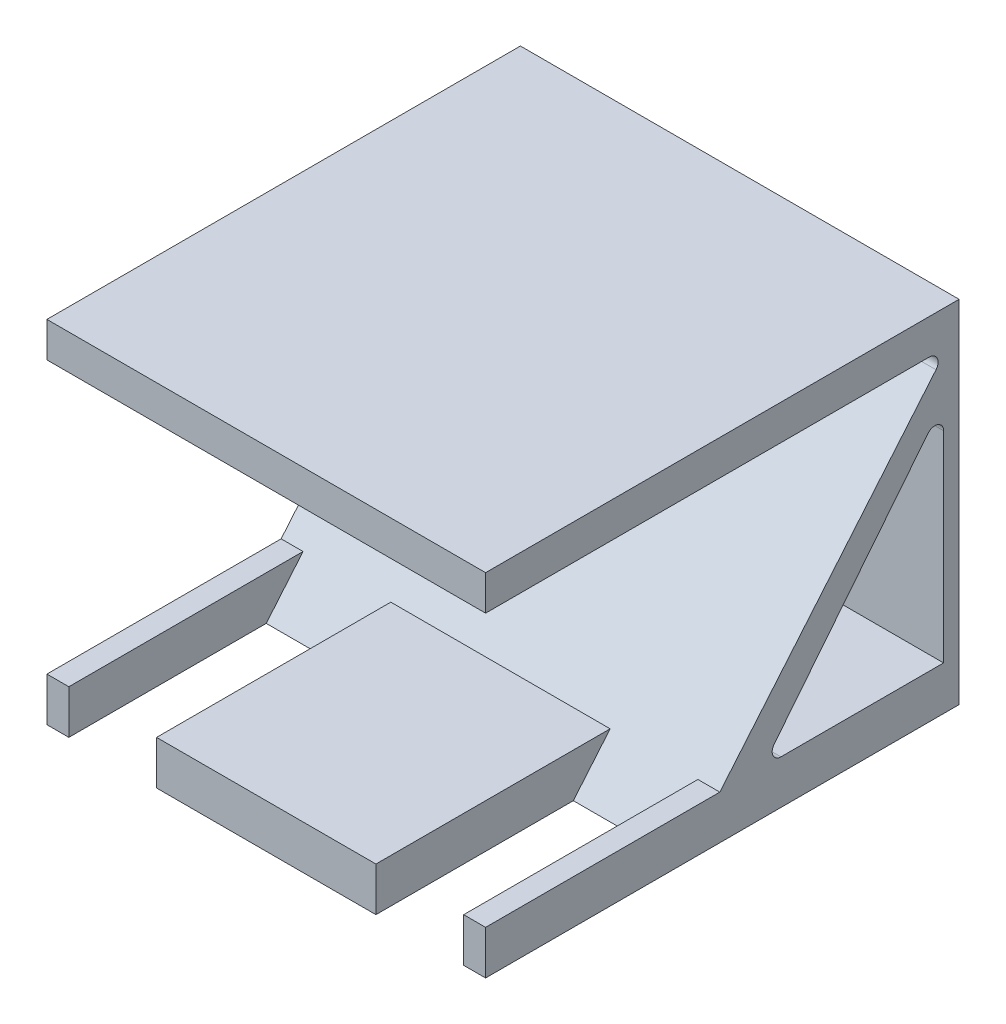
ISO-10303-21;
HEADER;
FILE_DESCRIPTION(('STEP AP214'),'2;1');
FILE_NAME('part.step','',(''),(''),'','','');
FILE_SCHEMA(('AUTOMOTIVE_DESIGN { 1 0 10303 214 1 1 1 1 }'));
ENDSEC;
DATA;
#1=APPLICATION_CONTEXT('core data for automotive mechanical design processes');
#2=APPLICATION_PROTOCOL_DEFINITION('international standard','automotive_design',2000,#1);
#3=PRODUCT_CONTEXT('',#1,'mechanical');
#4=PRODUCT('Part','Part','',(#3));
#5=PRODUCT_RELATED_PRODUCT_CATEGORY('part','',(#4));
#6=PRODUCT_DEFINITION_FORMATION('','',#4);
#7=PRODUCT_DEFINITION_CONTEXT('part definition',#1,'design');
#8=PRODUCT_DEFINITION('design','',#6,#7);
#9=PRODUCT_DEFINITION_SHAPE('','',#8);
#10=(LENGTH_UNIT() NAMED_UNIT(*) SI_UNIT(.MILLI.,.METRE.));
#11=(NAMED_UNIT(*) PLANE_ANGLE_UNIT() SI_UNIT($,.RADIAN.));
#12=(NAMED_UNIT(*) SI_UNIT($,.STERADIAN.) SOLID_ANGLE_UNIT());
#13=UNCERTAINTY_MEASURE_WITH_UNIT(LENGTH_MEASURE(1.E-05),#10,'distance_accuracy_value','');
#14=(GEOMETRIC_REPRESENTATION_CONTEXT(3) GLOBAL_UNCERTAINTY_ASSIGNED_CONTEXT((#13)) GLOBAL_UNIT_ASSIGNED_CONTEXT((#10,
#11,#12)) REPRESENTATION_CONTEXT('',''));
#15=CARTESIAN_POINT('',(0.,0.,0.));
#16=DIRECTION('',(0.,0.,1.));
#17=DIRECTION('',(1.,0.,0.));
#18=AXIS2_PLACEMENT_3D('',#15,#16,#17);
#19=CARTESIAN_POINT('',(-50.,10.,0.));
#20=DIRECTION('',(-1.,0.,0.));
#21=DIRECTION('',(0.,0.,1.));
#22=AXIS2_PLACEMENT_3D('',#19,#20,#21);
#23=PLANE('',#22);
#24=DIRECTION('',(0.,0.,1.));
#25=VECTOR('',#24,1.);
#26=CARTESIAN_POINT('',(-50.,80.018086391554,-62.9324723382966));
#27=LINE('',#26,#25);
#28=CARTESIAN_POINT('',(-50.,80.018086391554,-62.9324723382966));
#29=VERTEX_POINT('',#28);
#30=CARTESIAN_POINT('',(-50.,80.018086391554,45.));
#31=VERTEX_POINT('',#30);
#32=EDGE_CURVE('E208',#29,#31,#27,.T.);
#33=ORIENTED_EDGE('',*,*,#32,.F.);
#34=DIRECTION('',(0.,1.,0.));
#35=VECTOR('',#34,1.);
#36=CARTESIAN_POINT('',(-50.,0.,-62.9324723382966));
#37=LINE('',#36,#35);
#38=CARTESIAN_POINT('',(-50.,0.,-62.9324723382966));
#39=VERTEX_POINT('',#38);
#40=EDGE_CURVE('E292',#39,#29,#37,.T.);
#41=ORIENTED_EDGE('',*,*,#40,.F.);
#42=DIRECTION('',(0.,0.,-1.));
#43=VECTOR('',#42,1.);
#44=CARTESIAN_POINT('',(-50.,0.,0.));
#45=LINE('',#44,#43);
#46=CARTESIAN_POINT('',(-50.,0.,45.));
#47=VERTEX_POINT('',#46);
#48=EDGE_CURVE('E327',#47,#39,#45,.T.);
#49=ORIENTED_EDGE('',*,*,#48,.F.);
#50=DIRECTION('',(0.,-1.,0.));
#51=VECTOR('',#50,1.);
#52=CARTESIAN_POINT('',(-50.,10.,45.));
#53=LINE('',#52,#51);
#54=CARTESIAN_POINT('',(-50.,10.,45.));
#55=VERTEX_POINT('',#54);
#56=EDGE_CURVE('E333',#55,#47,#53,.T.);
#57=ORIENTED_EDGE('',*,*,#56,.F.);
#58=DIRECTION('',(0.,0.,-1.));
#59=VECTOR('',#58,1.);
#60=CARTESIAN_POINT('',(-50.,10.,0.));
#61=LINE('',#60,#59);
#62=CARTESIAN_POINT('',(-50.,10.,-8.39099631177287));
#63=VERTEX_POINT('',#62);
#64=EDGE_CURVE('E318',#55,#63,#61,.T.);
#65=ORIENTED_EDGE('',*,*,#64,.T.);
#66=DIRECTION('',(0.,-0.766044443118975,0.642787609686543));
#67=VECTOR('',#66,1.);
#68=CARTESIAN_POINT('',(-50.,0.,0.));
#69=LINE('',#68,#67);
#70=CARTESIAN_POINT('',(-50.,68.7325111721809,-57.6734247744658));
#71=VERTEX_POINT('',#70);
#72=EDGE_CURVE('E296',#71,#63,#69,.T.);
#73=ORIENTED_EDGE('',*,*,#72,.F.);
#74=CARTESIAN_POINT('',(-50.,70.018086391554,-56.1413358882279));
#75=DIRECTION('',(-1.,0.,0.));
#76=DIRECTION('',(0.,0.,1.));
#77=AXIS2_PLACEMENT_3D('',#74,#75,#76);
#78=CIRCLE('',#77,2.);
#79=CARTESIAN_POINT('',(-50.,72.018086391554,-56.1413358882279));
#80=VERTEX_POINT('',#79);
#81=EDGE_CURVE('E11',#71,#80,#78,.F.);
#82=ORIENTED_EDGE('',*,*,#81,.T.);
#83=DIRECTION('',(0.,0.,-1.));
#84=VECTOR('',#83,1.);
#85=CARTESIAN_POINT('',(-50.,72.018086391554,-62.9324723382966));
#86=LINE('',#85,#84);
#87=CARTESIAN_POINT('',(-50.,72.018086391554,45.));
#88=VERTEX_POINT('',#87);
#89=EDGE_CURVE('E227',#88,#80,#86,.T.);
#90=ORIENTED_EDGE('',*,*,#89,.F.);
#91=DIRECTION('',(0.,-1.,0.));
#92=VECTOR('',#91,1.);
#93=CARTESIAN_POINT('',(-50.,72.018086391554,45.));
#94=LINE('',#93,#92);
#95=EDGE_CURVE('E233',#31,#88,#94,.T.);
#96=ORIENTED_EDGE('',*,*,#95,.F.);
#97=EDGE_LOOP('',(#33,#41,#49,#57,#65,#73,#82,#90,#96));
#98=FACE_BOUND('',#97,.T.);
#99=DIRECTION('',(0.,0.,1.));
#100=VECTOR('',#99,1.);
#101=CARTESIAN_POINT('',(-50.,10.,-59.3985052477175));
#102=LINE('',#101,#100);
#103=CARTESIAN_POINT('',(-50.,10.,-59.3985052477175));
#104=VERTEX_POINT('',#103);
#105=CARTESIAN_POINT('',(-50.,10.,-22.3186865983815));
#106=VERTEX_POINT('',#105);
#107=EDGE_CURVE('E220',#104,#106,#102,.T.);
#108=ORIENTED_EDGE('',*,*,#107,.F.);
#109=DIRECTION('',(0.,-1.,0.));
#110=VECTOR('',#109,1.);
#111=CARTESIAN_POINT('',(-50.,61.5268113359665,-59.3985052477175));
#112=LINE('',#111,#110);
#113=CARTESIAN_POINT('',(-50.,55.827509606127,-59.3985052477175));
#114=VERTEX_POINT('',#113);
#115=EDGE_CURVE('E204',#114,#104,#112,.T.);
#116=ORIENTED_EDGE('',*,*,#115,.F.);
#117=CARTESIAN_POINT('',(-50.,55.827509606127,-57.3985052477175));
#118=DIRECTION('',(-1.,0.,0.));
#119=DIRECTION('',(0.,0.,1.));
#120=AXIS2_PLACEMENT_3D('',#117,#118,#119);
#121=CIRCLE('',#120,2.);
#122=CARTESIAN_POINT('',(-50.,57.0772865807444,-55.8370772110421));
#123=VERTEX_POINT('',#122);
#124=EDGE_CURVE('E354',#114,#123,#121,.F.);
#125=ORIENTED_EDGE('',*,*,#124,.T.);
#126=DIRECTION('',(0.,0.78071401833771,-0.624888487308724));
#127=VECTOR('',#126,1.);
#128=CARTESIAN_POINT('',(-50.,10.,-18.1561163123542));
#129=LINE('',#128,#127);
#130=CARTESIAN_POINT('',(-50.,13.2497769746174,-20.757258561706));
#131=VERTEX_POINT('',#130);
#132=EDGE_CURVE('E209',#131,#123,#129,.T.);
#133=ORIENTED_EDGE('',*,*,#132,.F.);
#134=CARTESIAN_POINT('',(-50.,12.,-22.3186865983814));
#135=DIRECTION('',(-1.,0.,0.));
#136=DIRECTION('',(0.,0.,1.));
#137=AXIS2_PLACEMENT_3D('',#134,#135,#136);
#138=CIRCLE('',#137,2.);
#139=EDGE_CURVE('E351',#131,#106,#138,.F.);
#140=ORIENTED_EDGE('',*,*,#139,.T.);
#141=EDGE_LOOP('',(#108,#116,#125,#133,#140));
#142=FACE_BOUND('',#141,.T.);
#143=ADVANCED_FACE('F43',(#98,#142),#23,.T.);
#144=CARTESIAN_POINT('',(50.,0.,0.));
#145=DIRECTION('',(1.,0.,0.));
#146=DIRECTION('',(0.,0.,-1.));
#147=AXIS2_PLACEMENT_3D('',#144,#145,#146);
#148=PLANE('',#147);
#149=DIRECTION('',(0.,1.,0.));
#150=VECTOR('',#149,1.);
#151=CARTESIAN_POINT('',(50.,0.,-62.9324723382966));
#152=LINE('',#151,#150);
#153=CARTESIAN_POINT('',(50.,0.,-62.9324723382966));
#154=VERTEX_POINT('',#153);
#155=CARTESIAN_POINT('',(50.,80.018086391554,-62.9324723382966));
#156=VERTEX_POINT('',#155);
#157=EDGE_CURVE('E295',#154,#156,#152,.T.);
#158=ORIENTED_EDGE('',*,*,#157,.T.);
#159=DIRECTION('',(0.,0.,1.));
#160=VECTOR('',#159,1.);
#161=CARTESIAN_POINT('',(50.,80.018086391554,-62.9324723382966));
#162=LINE('',#161,#160);
#163=CARTESIAN_POINT('',(50.,80.018086391554,45.));
#164=VERTEX_POINT('',#163);
#165=EDGE_CURVE('E224',#156,#164,#162,.T.);
#166=ORIENTED_EDGE('',*,*,#165,.T.);
#167=DIRECTION('',(0.,-1.,0.));
#168=VECTOR('',#167,1.);
#169=CARTESIAN_POINT('',(50.,72.018086391554,45.));
#170=LINE('',#169,#168);
#171=CARTESIAN_POINT('',(50.,72.018086391554,45.));
#172=VERTEX_POINT('',#171);
#173=EDGE_CURVE('E226',#164,#172,#170,.T.);
#174=ORIENTED_EDGE('',*,*,#173,.T.);
#175=DIRECTION('',(0.,0.,-1.));
#176=VECTOR('',#175,1.);
#177=CARTESIAN_POINT('',(50.,72.018086391554,-62.9324723382966));
#178=LINE('',#177,#176);
#179=CARTESIAN_POINT('',(50.,72.018086391554,-56.1413358882279));
#180=VERTEX_POINT('',#179);
#181=EDGE_CURVE('E229',#172,#180,#178,.T.);
#182=ORIENTED_EDGE('',*,*,#181,.T.);
#183=CARTESIAN_POINT('',(50.,70.018086391554,-56.1413358882279));
#184=DIRECTION('',(1.,0.,0.));
#185=DIRECTION('',(0.,0.,-1.));
#186=AXIS2_PLACEMENT_3D('',#183,#184,#185);
#187=CIRCLE('',#186,2.);
#188=CARTESIAN_POINT('',(50.,68.7325111721809,-57.6734247744658));
#189=VERTEX_POINT('',#188);
#190=EDGE_CURVE('E51',#180,#189,#187,.F.);
#191=ORIENTED_EDGE('',*,*,#190,.T.);
#192=DIRECTION('',(0.,-0.766044443118975,0.642787609686543));
#193=VECTOR('',#192,1.);
#194=CARTESIAN_POINT('',(50.,0.,0.));
#195=LINE('',#194,#193);
#196=CARTESIAN_POINT('',(50.,10.,-8.39099631177287));
#197=VERTEX_POINT('',#196);
#198=EDGE_CURVE('E298',#189,#197,#195,.T.);
#199=ORIENTED_EDGE('',*,*,#198,.T.);
#200=DIRECTION('',(0.,0.,-1.));
#201=VECTOR('',#200,1.);
#202=CARTESIAN_POINT('',(50.,10.,0.));
#203=LINE('',#202,#201);
#204=CARTESIAN_POINT('',(50.,10.,45.));
#205=VERTEX_POINT('',#204);
#206=EDGE_CURVE('E277',#205,#197,#203,.T.);
#207=ORIENTED_EDGE('',*,*,#206,.F.);
#208=DIRECTION('',(0.,-1.,0.));
#209=VECTOR('',#208,1.);
#210=CARTESIAN_POINT('',(50.,10.,45.));
#211=LINE('',#210,#209);
#212=CARTESIAN_POINT('',(50.,0.,45.));
#213=VERTEX_POINT('',#212);
#214=EDGE_CURVE('E280',#205,#213,#211,.T.);
#215=ORIENTED_EDGE('',*,*,#214,.T.);
#216=DIRECTION('',(0.,0.,-1.));
#217=VECTOR('',#216,1.);
#218=CARTESIAN_POINT('',(50.,0.,0.));
#219=LINE('',#218,#217);
#220=EDGE_CURVE('E293',#213,#154,#219,.T.);
#221=ORIENTED_EDGE('',*,*,#220,.T.);
#222=EDGE_LOOP('',(#158,#166,#174,#182,#191,#199,#207,#215,#221));
#223=FACE_BOUND('',#222,.T.);
#224=DIRECTION('',(0.,0.,1.));
#225=VECTOR('',#224,1.);
#226=CARTESIAN_POINT('',(50.,10.,-59.3985052477175));
#227=LINE('',#226,#225);
#228=CARTESIAN_POINT('',(50.,10.,-59.3985052477175));
#229=VERTEX_POINT('',#228);
#230=CARTESIAN_POINT('',(50.,10.,-22.3186865983815));
#231=VERTEX_POINT('',#230);
#232=EDGE_CURVE('E194',#229,#231,#227,.T.);
#233=ORIENTED_EDGE('',*,*,#232,.T.);
#234=CARTESIAN_POINT('',(50.,12.,-22.3186865983814));
#235=DIRECTION('',(1.,0.,0.));
#236=DIRECTION('',(0.,0.,-1.));
#237=AXIS2_PLACEMENT_3D('',#234,#235,#236);
#238=CIRCLE('',#237,2.);
#239=CARTESIAN_POINT('',(50.,13.2497769746174,-20.757258561706));
#240=VERTEX_POINT('',#239);
#241=EDGE_CURVE('E349',#231,#240,#238,.F.);
#242=ORIENTED_EDGE('',*,*,#241,.T.);
#243=DIRECTION('',(0.,0.78071401833771,-0.624888487308724));
#244=VECTOR('',#243,1.);
#245=CARTESIAN_POINT('',(50.,10.,-18.1561163123542));
#246=LINE('',#245,#244);
#247=CARTESIAN_POINT('',(50.,57.0772865807444,-55.8370772110421));
#248=VERTEX_POINT('',#247);
#249=EDGE_CURVE('E215',#240,#248,#246,.T.);
#250=ORIENTED_EDGE('',*,*,#249,.T.);
#251=CARTESIAN_POINT('',(50.,55.827509606127,-57.3985052477175));
#252=DIRECTION('',(1.,0.,0.));
#253=DIRECTION('',(0.,0.,-1.));
#254=AXIS2_PLACEMENT_3D('',#251,#252,#253);
#255=CIRCLE('',#254,2.);
#256=CARTESIAN_POINT('',(50.,55.827509606127,-59.3985052477175));
#257=VERTEX_POINT('',#256);
#258=EDGE_CURVE('E196',#248,#257,#255,.F.);
#259=ORIENTED_EDGE('',*,*,#258,.T.);
#260=DIRECTION('',(0.,-1.,0.));
#261=VECTOR('',#260,1.);
#262=CARTESIAN_POINT('',(50.,61.5268113359665,-59.3985052477175));
#263=LINE('',#262,#261);
#264=EDGE_CURVE('E190',#257,#229,#263,.T.);
#265=ORIENTED_EDGE('',*,*,#264,.T.);
#266=EDGE_LOOP('',(#233,#242,#250,#259,#265));
#267=FACE_BOUND('',#266,.T.);
#268=ADVANCED_FACE('F192',(#223,#267),#148,.T.);
#269=CARTESIAN_POINT('',(50.,0.,0.));
#270=DIRECTION('',(0.,-0.642787609686543,-0.766044443118975));
#271=DIRECTION('',(0.,0.766044443118975,-0.642787609686543));
#272=AXIS2_PLACEMENT_3D('',#269,#270,#271);
#273=PLANE('',#272);
#274=ORIENTED_EDGE('',*,*,#198,.F.);
#275=DIRECTION('',(1.,0.,0.));
#276=VECTOR('',#275,1.);
#277=CARTESIAN_POINT('',(-50.,68.7325111721809,-57.6734247744659));
#278=LINE('',#277,#276);
#279=EDGE_CURVE('E64',#189,#71,#278,.F.);
#280=ORIENTED_EDGE('',*,*,#279,.T.);
#281=ORIENTED_EDGE('',*,*,#72,.T.);
#282=DIRECTION('',(-1.,0.,0.));
#283=VECTOR('',#282,1.);
#284=CARTESIAN_POINT('',(0.,10.,-8.39099631177287));
#285=LINE('',#284,#283);
#286=CARTESIAN_POINT('',(-45.,10.,-8.39099631177287));
#287=VERTEX_POINT('',#286);
#288=EDGE_CURVE('E309',#287,#63,#285,.T.);
#289=ORIENTED_EDGE('',*,*,#288,.F.);
#290=DIRECTION('',(0.,0.766044443118975,-0.642787609686543));
#291=VECTOR('',#290,1.);
#292=CARTESIAN_POINT('',(-45.,5.86824088833461,-4.92403876506104));
#293=LINE('',#292,#291);
#294=CARTESIAN_POINT('',(-45.,0.,0.));
#295=VERTEX_POINT('',#294);
#296=EDGE_CURVE('E312',#295,#287,#293,.T.);
#297=ORIENTED_EDGE('',*,*,#296,.F.);
#298=DIRECTION('',(-1.,0.,0.));
#299=VECTOR('',#298,1.);
#300=CARTESIAN_POINT('',(50.,0.,0.));
#301=LINE('',#300,#299);
#302=CARTESIAN_POINT('',(-25.,0.,0.));
#303=VERTEX_POINT('',#302);
#304=EDGE_CURVE('E300',#303,#295,#301,.T.);
#305=ORIENTED_EDGE('',*,*,#304,.F.);
#306=DIRECTION('',(0.,-0.766044443118975,0.642787609686543));
#307=VECTOR('',#306,1.);
#308=CARTESIAN_POINT('',(-25.,0.,0.));
#309=LINE('',#308,#307);
#310=CARTESIAN_POINT('',(-25.,10.,-8.39099631177287));
#311=VERTEX_POINT('',#310);
#312=EDGE_CURVE('E265',#311,#303,#309,.T.);
#313=ORIENTED_EDGE('',*,*,#312,.F.);
#314=DIRECTION('',(1.,0.,0.));
#315=VECTOR('',#314,1.);
#316=CARTESIAN_POINT('',(50.,10.,-8.39099631177287));
#317=LINE('',#316,#315);
#318=CARTESIAN_POINT('',(25.,10.,-8.39099631177287));
#319=VERTEX_POINT('',#318);
#320=EDGE_CURVE('E338',#311,#319,#317,.T.);
#321=ORIENTED_EDGE('',*,*,#320,.T.);
#322=DIRECTION('',(0.,-0.766044443118975,0.642787609686543));
#323=VECTOR('',#322,1.);
#324=CARTESIAN_POINT('',(25.,0.,0.));
#325=LINE('',#324,#323);
#326=CARTESIAN_POINT('',(25.,0.,0.));
#327=VERTEX_POINT('',#326);
#328=EDGE_CURVE('E268',#319,#327,#325,.T.);
#329=ORIENTED_EDGE('',*,*,#328,.T.);
#330=CARTESIAN_POINT('',(45.,0.,0.));
#331=VERTEX_POINT('',#330);
#332=EDGE_CURVE('E303',#331,#327,#301,.T.);
#333=ORIENTED_EDGE('',*,*,#332,.F.);
#334=DIRECTION('',(0.,-0.766044443118975,0.642787609686543));
#335=VECTOR('',#334,1.);
#336=CARTESIAN_POINT('',(45.,0.,0.));
#337=LINE('',#336,#335);
#338=CARTESIAN_POINT('',(45.,10.,-8.39099631177287));
#339=VERTEX_POINT('',#338);
#340=EDGE_CURVE('E335',#339,#331,#337,.T.);
#341=ORIENTED_EDGE('',*,*,#340,.F.);
#342=DIRECTION('',(1.,0.,0.));
#343=VECTOR('',#342,1.);
#344=CARTESIAN_POINT('',(50.,10.,-8.39099631177287));
#345=LINE('',#344,#343);
#346=EDGE_CURVE('E289',#339,#197,#345,.T.);
#347=ORIENTED_EDGE('',*,*,#346,.T.);
#348=EDGE_LOOP('',(#274,#280,#281,#289,#297,#305,#313,#321,#329,#333,#341,#347));
#349=FACE_BOUND('',#348,.T.);
#350=ADVANCED_FACE('F389',(#349),#273,.F.);
#351=CARTESIAN_POINT('',(-45.,10.,0.));
#352=DIRECTION('',(1.,0.,0.));
#353=DIRECTION('',(0.,0.,-1.));
#354=AXIS2_PLACEMENT_3D('',#351,#352,#353);
#355=PLANE('',#354);
#356=DIRECTION('',(0.,0.,1.));
#357=VECTOR('',#356,1.);
#358=CARTESIAN_POINT('',(-45.,0.,0.));
#359=LINE('',#358,#357);
#360=CARTESIAN_POINT('',(-45.,0.,45.));
#361=VERTEX_POINT('',#360);
#362=EDGE_CURVE('E315',#295,#361,#359,.T.);
#363=ORIENTED_EDGE('',*,*,#362,.F.);
#364=ORIENTED_EDGE('',*,*,#296,.T.);
#365=DIRECTION('',(0.,0.,1.));
#366=VECTOR('',#365,1.);
#367=CARTESIAN_POINT('',(-45.,10.,0.));
#368=LINE('',#367,#366);
#369=CARTESIAN_POINT('',(-45.,10.,45.));
#370=VERTEX_POINT('',#369);
#371=EDGE_CURVE('E316',#287,#370,#368,.T.);
#372=ORIENTED_EDGE('',*,*,#371,.T.);
#373=DIRECTION('',(0.,-1.,0.));
#374=VECTOR('',#373,1.);
#375=CARTESIAN_POINT('',(-45.,10.,45.));
#376=LINE('',#375,#374);
#377=EDGE_CURVE('E325',#370,#361,#376,.T.);
#378=ORIENTED_EDGE('',*,*,#377,.T.);
#379=EDGE_LOOP('',(#363,#364,#372,#378));
#380=FACE_BOUND('',#379,.T.);
#381=ADVANCED_FACE('F395',(#380),#355,.T.);
#382=CARTESIAN_POINT('',(0.,10.,0.));
#383=DIRECTION('',(0.,1.,0.));
#384=DIRECTION('',(0.,0.,1.));
#385=AXIS2_PLACEMENT_3D('',#382,#383,#384);
#386=PLANE('',#385);
#387=ORIENTED_EDGE('',*,*,#371,.F.);
#388=ORIENTED_EDGE('',*,*,#288,.T.);
#389=ORIENTED_EDGE('',*,*,#64,.F.);
#390=DIRECTION('',(1.,0.,0.));
#391=VECTOR('',#390,1.);
#392=CARTESIAN_POINT('',(0.,10.,45.));
#393=LINE('',#392,#391);
#394=EDGE_CURVE('E322',#55,#370,#393,.T.);
#395=ORIENTED_EDGE('',*,*,#394,.T.);
#396=EDGE_LOOP('',(#387,#388,#389,#395));
#397=FACE_BOUND('',#396,.T.);
#398=ADVANCED_FACE('F398',(#397),#386,.T.);
#399=CARTESIAN_POINT('',(0.,10.,45.));
#400=DIRECTION('',(0.,0.,-1.));
#401=DIRECTION('',(-1.,0.,0.));
#402=AXIS2_PLACEMENT_3D('',#399,#400,#401);
#403=PLANE('',#402);
#404=DIRECTION('',(1.,0.,0.));
#405=VECTOR('',#404,1.);
#406=CARTESIAN_POINT('',(0.,0.,45.));
#407=LINE('',#406,#405);
#408=EDGE_CURVE('E319',#47,#361,#407,.T.);
#409=ORIENTED_EDGE('',*,*,#408,.T.);
#410=ORIENTED_EDGE('',*,*,#377,.F.);
#411=ORIENTED_EDGE('',*,*,#394,.F.);
#412=ORIENTED_EDGE('',*,*,#56,.T.);
#413=EDGE_LOOP('',(#409,#410,#411,#412));
#414=FACE_BOUND('',#413,.T.);
#415=ADVANCED_FACE('F393',(#414),#403,.F.);
#416=CARTESIAN_POINT('',(0.,0.,0.));
#417=DIRECTION('',(0.,1.,0.));
#418=DIRECTION('',(0.,0.,1.));
#419=AXIS2_PLACEMENT_3D('',#416,#417,#418);
#420=PLANE('',#419);
#421=ORIENTED_EDGE('',*,*,#332,.T.);
#422=DIRECTION('',(0.,0.,1.));
#423=VECTOR('',#422,1.);
#424=CARTESIAN_POINT('',(25.,0.,0.));
#425=LINE('',#424,#423);
#426=CARTESIAN_POINT('',(25.,0.,45.));
#427=VERTEX_POINT('',#426);
#428=EDGE_CURVE('E245',#327,#427,#425,.T.);
#429=ORIENTED_EDGE('',*,*,#428,.T.);
#430=DIRECTION('',(1.,0.,0.));
#431=VECTOR('',#430,1.);
#432=CARTESIAN_POINT('',(0.,0.,45.));
#433=LINE('',#432,#431);
#434=CARTESIAN_POINT('',(-25.,0.,45.));
#435=VERTEX_POINT('',#434);
#436=EDGE_CURVE('E249',#435,#427,#433,.T.);
#437=ORIENTED_EDGE('',*,*,#436,.F.);
#438=DIRECTION('',(0.,0.,1.));
#439=VECTOR('',#438,1.);
#440=CARTESIAN_POINT('',(-25.,0.,0.));
#441=LINE('',#440,#439);
#442=EDGE_CURVE('E256',#303,#435,#441,.T.);
#443=ORIENTED_EDGE('',*,*,#442,.F.);
#444=ORIENTED_EDGE('',*,*,#304,.T.);
#445=ORIENTED_EDGE('',*,*,#362,.T.);
#446=ORIENTED_EDGE('',*,*,#408,.F.);
#447=ORIENTED_EDGE('',*,*,#48,.T.);
#448=DIRECTION('',(-1.,0.,0.));
#449=VECTOR('',#448,1.);
#450=CARTESIAN_POINT('',(50.,0.,-62.9324723382966));
#451=LINE('',#450,#449);
#452=EDGE_CURVE('E306',#154,#39,#451,.T.);
#453=ORIENTED_EDGE('',*,*,#452,.F.);
#454=ORIENTED_EDGE('',*,*,#220,.F.);
#455=DIRECTION('',(1.,0.,0.));
#456=VECTOR('',#455,1.);
#457=CARTESIAN_POINT('',(0.,0.,45.));
#458=LINE('',#457,#456);
#459=CARTESIAN_POINT('',(45.,0.,45.));
#460=VERTEX_POINT('',#459);
#461=EDGE_CURVE('E275',#460,#213,#458,.T.);
#462=ORIENTED_EDGE('',*,*,#461,.F.);
#463=DIRECTION('',(0.,0.,1.));
#464=VECTOR('',#463,1.);
#465=CARTESIAN_POINT('',(45.,0.,0.));
#466=LINE('',#465,#464);
#467=EDGE_CURVE('E271',#331,#460,#466,.T.);
#468=ORIENTED_EDGE('',*,*,#467,.F.);
#469=EDGE_LOOP('',(#421,#429,#437,#443,#444,#445,#446,#447,#453,#454,#462,#468));
#470=FACE_BOUND('',#469,.T.);
#471=ADVANCED_FACE('F461',(#470),#420,.F.);
#472=CARTESIAN_POINT('',(50.,0.,-62.9324723382966));
#473=DIRECTION('',(0.,0.,1.));
#474=DIRECTION('',(1.,0.,0.));
#475=AXIS2_PLACEMENT_3D('',#472,#473,#474);
#476=PLANE('',#475);
#477=DIRECTION('',(-1.,0.,0.));
#478=VECTOR('',#477,1.);
#479=CARTESIAN_POINT('',(50.,80.018086391554,-62.9324723382966));
#480=LINE('',#479,#478);
#481=EDGE_CURVE('E242',#156,#29,#480,.T.);
#482=ORIENTED_EDGE('',*,*,#481,.F.);
#483=ORIENTED_EDGE('',*,*,#157,.F.);
#484=ORIENTED_EDGE('',*,*,#452,.T.);
#485=ORIENTED_EDGE('',*,*,#40,.T.);
#486=EDGE_LOOP('',(#482,#483,#484,#485));
#487=FACE_BOUND('',#486,.T.);
#488=ADVANCED_FACE('F454',(#487),#476,.F.);
#489=CARTESIAN_POINT('',(45.,10.,0.));
#490=DIRECTION('',(1.,0.,0.));
#491=DIRECTION('',(0.,0.,-1.));
#492=AXIS2_PLACEMENT_3D('',#489,#490,#491);
#493=PLANE('',#492);
#494=DIRECTION('',(0.,0.,1.));
#495=VECTOR('',#494,1.);
#496=CARTESIAN_POINT('',(45.,10.,0.));
#497=LINE('',#496,#495);
#498=CARTESIAN_POINT('',(45.,10.,45.));
#499=VERTEX_POINT('',#498);
#500=EDGE_CURVE('E272',#339,#499,#497,.T.);
#501=ORIENTED_EDGE('',*,*,#500,.F.);
#502=ORIENTED_EDGE('',*,*,#340,.T.);
#503=ORIENTED_EDGE('',*,*,#467,.T.);
#504=DIRECTION('',(0.,-1.,0.));
#505=VECTOR('',#504,1.);
#506=CARTESIAN_POINT('',(45.,10.,45.));
#507=LINE('',#506,#505);
#508=EDGE_CURVE('E286',#499,#460,#507,.T.);
#509=ORIENTED_EDGE('',*,*,#508,.F.);
#510=EDGE_LOOP('',(#501,#502,#503,#509));
#511=FACE_BOUND('',#510,.T.);
#512=ADVANCED_FACE('F448',(#511),#493,.F.);
#513=CARTESIAN_POINT('',(0.,10.,0.));
#514=DIRECTION('',(0.,1.,0.));
#515=DIRECTION('',(0.,0.,1.));
#516=AXIS2_PLACEMENT_3D('',#513,#514,#515);
#517=PLANE('',#516);
#518=ORIENTED_EDGE('',*,*,#346,.F.);
#519=ORIENTED_EDGE('',*,*,#500,.T.);
#520=DIRECTION('',(1.,0.,0.));
#521=VECTOR('',#520,1.);
#522=CARTESIAN_POINT('',(0.,10.,45.));
#523=LINE('',#522,#521);
#524=EDGE_CURVE('E274',#499,#205,#523,.T.);
#525=ORIENTED_EDGE('',*,*,#524,.T.);
#526=ORIENTED_EDGE('',*,*,#206,.T.);
#527=EDGE_LOOP('',(#518,#519,#525,#526));
#528=FACE_BOUND('',#527,.T.);
#529=ADVANCED_FACE('F445',(#528),#517,.T.);
#530=CARTESIAN_POINT('',(0.,10.,45.));
#531=DIRECTION('',(0.,0.,-1.));
#532=DIRECTION('',(-1.,0.,0.));
#533=AXIS2_PLACEMENT_3D('',#530,#531,#532);
#534=PLANE('',#533);
#535=ORIENTED_EDGE('',*,*,#461,.T.);
#536=ORIENTED_EDGE('',*,*,#214,.F.);
#537=ORIENTED_EDGE('',*,*,#524,.F.);
#538=ORIENTED_EDGE('',*,*,#508,.T.);
#539=EDGE_LOOP('',(#535,#536,#537,#538));
#540=FACE_BOUND('',#539,.T.);
#541=ADVANCED_FACE('F433',(#540),#534,.F.);
#542=CARTESIAN_POINT('',(0.,10.,0.));
#543=DIRECTION('',(0.,1.,0.));
#544=DIRECTION('',(0.,0.,1.));
#545=AXIS2_PLACEMENT_3D('',#542,#543,#544);
#546=PLANE('',#545);
#547=ORIENTED_EDGE('',*,*,#320,.F.);
#548=DIRECTION('',(0.,0.,1.));
#549=VECTOR('',#548,1.);
#550=CARTESIAN_POINT('',(-25.,10.,0.));
#551=LINE('',#550,#549);
#552=CARTESIAN_POINT('',(-25.,10.,45.));
#553=VERTEX_POINT('',#552);
#554=EDGE_CURVE('E248',#311,#553,#551,.T.);
#555=ORIENTED_EDGE('',*,*,#554,.T.);
#556=DIRECTION('',(1.,0.,0.));
#557=VECTOR('',#556,1.);
#558=CARTESIAN_POINT('',(0.,10.,45.));
#559=LINE('',#558,#557);
#560=CARTESIAN_POINT('',(25.,10.,45.));
#561=VERTEX_POINT('',#560);
#562=EDGE_CURVE('E251',#553,#561,#559,.T.);
#563=ORIENTED_EDGE('',*,*,#562,.T.);
#564=DIRECTION('',(0.,0.,1.));
#565=VECTOR('',#564,1.);
#566=CARTESIAN_POINT('',(25.,10.,0.));
#567=LINE('',#566,#565);
#568=EDGE_CURVE('E246',#319,#561,#567,.T.);
#569=ORIENTED_EDGE('',*,*,#568,.F.);
#570=EDGE_LOOP('',(#547,#555,#563,#569));
#571=FACE_BOUND('',#570,.T.);
#572=ADVANCED_FACE('F429',(#571),#546,.T.);
#573=CARTESIAN_POINT('',(25.,10.,0.));
#574=DIRECTION('',(1.,0.,0.));
#575=DIRECTION('',(0.,0.,-1.));
#576=AXIS2_PLACEMENT_3D('',#573,#574,#575);
#577=PLANE('',#576);
#578=ORIENTED_EDGE('',*,*,#328,.F.);
#579=ORIENTED_EDGE('',*,*,#568,.T.);
#580=DIRECTION('',(0.,-1.,0.));
#581=VECTOR('',#580,1.);
#582=CARTESIAN_POINT('',(25.,10.,45.));
#583=LINE('',#582,#581);
#584=EDGE_CURVE('E254',#561,#427,#583,.T.);
#585=ORIENTED_EDGE('',*,*,#584,.T.);
#586=ORIENTED_EDGE('',*,*,#428,.F.);
#587=EDGE_LOOP('',(#578,#579,#585,#586));
#588=FACE_BOUND('',#587,.T.);
#589=ADVANCED_FACE('F432',(#588),#577,.T.);
#590=CARTESIAN_POINT('',(-25.,10.,0.));
#591=DIRECTION('',(1.,0.,0.));
#592=DIRECTION('',(0.,0.,-1.));
#593=AXIS2_PLACEMENT_3D('',#590,#591,#592);
#594=PLANE('',#593);
#595=ORIENTED_EDGE('',*,*,#554,.F.);
#596=ORIENTED_EDGE('',*,*,#312,.T.);
#597=ORIENTED_EDGE('',*,*,#442,.T.);
#598=DIRECTION('',(0.,-1.,0.));
#599=VECTOR('',#598,1.);
#600=CARTESIAN_POINT('',(-25.,10.,45.));
#601=LINE('',#600,#599);
#602=EDGE_CURVE('E262',#553,#435,#601,.T.);
#603=ORIENTED_EDGE('',*,*,#602,.F.);
#604=EDGE_LOOP('',(#595,#596,#597,#603));
#605=FACE_BOUND('',#604,.T.);
#606=ADVANCED_FACE('F437',(#605),#594,.F.);
#607=CARTESIAN_POINT('',(0.,10.,45.));
#608=DIRECTION('',(0.,0.,-1.));
#609=DIRECTION('',(-1.,0.,0.));
#610=AXIS2_PLACEMENT_3D('',#607,#608,#609);
#611=PLANE('',#610);
#612=ORIENTED_EDGE('',*,*,#436,.T.);
#613=ORIENTED_EDGE('',*,*,#584,.F.);
#614=ORIENTED_EDGE('',*,*,#562,.F.);
#615=ORIENTED_EDGE('',*,*,#602,.T.);
#616=EDGE_LOOP('',(#612,#613,#614,#615));
#617=FACE_BOUND('',#616,.T.);
#618=ADVANCED_FACE('F423',(#617),#611,.F.);
#619=CARTESIAN_POINT('',(50.,72.018086391554,-62.9324723382966));
#620=DIRECTION('',(0.,1.,0.));
#621=DIRECTION('',(0.,0.,1.));
#622=AXIS2_PLACEMENT_3D('',#619,#620,#621);
#623=PLANE('',#622);
#624=ORIENTED_EDGE('',*,*,#89,.T.);
#625=DIRECTION('',(1.,0.,0.));
#626=VECTOR('',#625,1.);
#627=CARTESIAN_POINT('',(50.,72.018086391554,-56.1413358882279));
#628=LINE('',#627,#626);
#629=EDGE_CURVE('E356',#80,#180,#628,.T.);
#630=ORIENTED_EDGE('',*,*,#629,.T.);
#631=ORIENTED_EDGE('',*,*,#181,.F.);
#632=DIRECTION('',(-1.,0.,0.));
#633=VECTOR('',#632,1.);
#634=CARTESIAN_POINT('',(50.,72.018086391554,45.));
#635=LINE('',#634,#633);
#636=EDGE_CURVE('E231',#172,#88,#635,.T.);
#637=ORIENTED_EDGE('',*,*,#636,.T.);
#638=EDGE_LOOP('',(#624,#630,#631,#637));
#639=FACE_BOUND('',#638,.T.);
#640=ADVANCED_FACE('F362',(#639),#623,.F.);
#641=CARTESIAN_POINT('',(50.,80.018086391554,-62.9324723382966));
#642=DIRECTION('',(0.,-1.,0.));
#643=DIRECTION('',(0.,0.,-1.));
#644=AXIS2_PLACEMENT_3D('',#641,#642,#643);
#645=PLANE('',#644);
#646=ORIENTED_EDGE('',*,*,#32,.T.);
#647=DIRECTION('',(-1.,0.,0.));
#648=VECTOR('',#647,1.);
#649=CARTESIAN_POINT('',(50.,80.018086391554,45.));
#650=LINE('',#649,#648);
#651=EDGE_CURVE('E239',#164,#31,#650,.T.);
#652=ORIENTED_EDGE('',*,*,#651,.F.);
#653=ORIENTED_EDGE('',*,*,#165,.F.);
#654=ORIENTED_EDGE('',*,*,#481,.T.);
#655=EDGE_LOOP('',(#646,#652,#653,#654));
#656=FACE_BOUND('',#655,.T.);
#657=ADVANCED_FACE('F422',(#656),#645,.F.);
#658=CARTESIAN_POINT('',(50.,72.018086391554,45.));
#659=DIRECTION('',(0.,0.,-1.));
#660=DIRECTION('',(-1.,0.,0.));
#661=AXIS2_PLACEMENT_3D('',#658,#659,#660);
#662=PLANE('',#661);
#663=ORIENTED_EDGE('',*,*,#95,.T.);
#664=ORIENTED_EDGE('',*,*,#636,.F.);
#665=ORIENTED_EDGE('',*,*,#173,.F.);
#666=ORIENTED_EDGE('',*,*,#651,.T.);
#667=EDGE_LOOP('',(#663,#664,#665,#666));
#668=FACE_BOUND('',#667,.T.);
#669=ADVANCED_FACE('F371',(#668),#662,.F.);
#670=CARTESIAN_POINT('',(-50.,61.5268113359665,-59.3985052477175));
#671=DIRECTION('',(0.,0.,1.));
#672=DIRECTION('',(1.,0.,0.));
#673=AXIS2_PLACEMENT_3D('',#670,#671,#672);
#674=PLANE('',#673);
#675=ORIENTED_EDGE('',*,*,#264,.F.);
#676=DIRECTION('',(1.,0.,0.));
#677=VECTOR('',#676,1.);
#678=CARTESIAN_POINT('',(-50.,55.827509606127,-59.3985052477175));
#679=LINE('',#678,#677);
#680=EDGE_CURVE('E347',#257,#114,#679,.F.);
#681=ORIENTED_EDGE('',*,*,#680,.T.);
#682=ORIENTED_EDGE('',*,*,#115,.T.);
#683=DIRECTION('',(1.,0.,0.));
#684=VECTOR('',#683,1.);
#685=CARTESIAN_POINT('',(-50.,10.,-59.3985052477175));
#686=LINE('',#685,#684);
#687=EDGE_CURVE('E201',#104,#229,#686,.T.);
#688=ORIENTED_EDGE('',*,*,#687,.T.);
#689=EDGE_LOOP('',(#675,#681,#682,#688));
#690=FACE_BOUND('',#689,.T.);
#691=ADVANCED_FACE('F202',(#690),#674,.T.);
#692=CARTESIAN_POINT('',(-50.,10.,-59.3985052477175));
#693=DIRECTION('',(0.,1.,0.));
#694=DIRECTION('',(0.,0.,1.));
#695=AXIS2_PLACEMENT_3D('',#692,#693,#694);
#696=PLANE('',#695);
#697=ORIENTED_EDGE('',*,*,#107,.T.);
#698=DIRECTION('',(1.,0.,0.));
#699=VECTOR('',#698,1.);
#700=CARTESIAN_POINT('',(50.,10.,-22.3186865983814));
#701=LINE('',#700,#699);
#702=EDGE_CURVE('E214',#106,#231,#701,.T.);
#703=ORIENTED_EDGE('',*,*,#702,.T.);
#704=ORIENTED_EDGE('',*,*,#232,.F.);
#705=ORIENTED_EDGE('',*,*,#687,.F.);
#706=EDGE_LOOP('',(#697,#703,#704,#705));
#707=FACE_BOUND('',#706,.T.);
#708=ADVANCED_FACE('F212',(#707),#696,.T.);
#709=CARTESIAN_POINT('',(-50.,10.,-18.1561163123542));
#710=DIRECTION('',(0.,-0.624888487308724,-0.78071401833771));
#711=DIRECTION('',(0.,0.78071401833771,-0.624888487308724));
#712=AXIS2_PLACEMENT_3D('',#709,#710,#711);
#713=PLANE('',#712);
#714=ORIENTED_EDGE('',*,*,#249,.F.);
#715=DIRECTION('',(1.,0.,0.));
#716=VECTOR('',#715,1.);
#717=CARTESIAN_POINT('',(-50.,13.2497769746174,-20.757258561706));
#718=LINE('',#717,#716);
#719=EDGE_CURVE('E345',#240,#131,#718,.F.);
#720=ORIENTED_EDGE('',*,*,#719,.T.);
#721=ORIENTED_EDGE('',*,*,#132,.T.);
#722=DIRECTION('',(1.,0.,0.));
#723=VECTOR('',#722,1.);
#724=CARTESIAN_POINT('',(50.,57.0772865807444,-55.837077211042));
#725=LINE('',#724,#723);
#726=EDGE_CURVE('E342',#123,#248,#725,.T.);
#727=ORIENTED_EDGE('',*,*,#726,.T.);
#728=EDGE_LOOP('',(#714,#720,#721,#727));
#729=FACE_BOUND('',#728,.T.);
#730=ADVANCED_FACE('F401',(#729),#713,.T.);
#731=CARTESIAN_POINT('',(-50.,12.,-22.3186865983814));
#732=DIRECTION('',(-1.,0.,0.));
#733=DIRECTION('',(0.,0.,1.));
#734=AXIS2_PLACEMENT_3D('',#731,#732,#733);
#735=CYLINDRICAL_SURFACE('',#734,2.);
#736=ORIENTED_EDGE('',*,*,#139,.F.);
#737=ORIENTED_EDGE('',*,*,#719,.F.);
#738=ORIENTED_EDGE('',*,*,#241,.F.);
#739=ORIENTED_EDGE('',*,*,#702,.F.);
#740=EDGE_LOOP('',(#736,#737,#738,#739));
#741=FACE_BOUND('',#740,.T.);
#742=ADVANCED_FACE('F382',(#741),#735,.F.);
#743=CARTESIAN_POINT('',(-50.,55.827509606127,-57.3985052477175));
#744=DIRECTION('',(-1.,0.,0.));
#745=DIRECTION('',(0.,0.,1.));
#746=AXIS2_PLACEMENT_3D('',#743,#744,#745);
#747=CYLINDRICAL_SURFACE('',#746,2.);
#748=ORIENTED_EDGE('',*,*,#124,.F.);
#749=ORIENTED_EDGE('',*,*,#680,.F.);
#750=ORIENTED_EDGE('',*,*,#258,.F.);
#751=ORIENTED_EDGE('',*,*,#726,.F.);
#752=EDGE_LOOP('',(#748,#749,#750,#751));
#753=FACE_BOUND('',#752,.T.);
#754=ADVANCED_FACE('F377',(#753),#747,.F.);
#755=CARTESIAN_POINT('',(50.,70.018086391554,-56.1413358882279));
#756=DIRECTION('',(-1.,0.,0.));
#757=DIRECTION('',(0.,0.,1.));
#758=AXIS2_PLACEMENT_3D('',#755,#756,#757);
#759=CYLINDRICAL_SURFACE('',#758,2.);
#760=ORIENTED_EDGE('',*,*,#81,.F.);
#761=ORIENTED_EDGE('',*,*,#279,.F.);
#762=ORIENTED_EDGE('',*,*,#190,.F.);
#763=ORIENTED_EDGE('',*,*,#629,.F.);
#764=EDGE_LOOP('',(#760,#761,#762,#763));
#765=FACE_BOUND('',#764,.T.);
#766=ADVANCED_FACE('F45',(#765),#759,.F.);
#767=CLOSED_SHELL('',(#143,#268,#350,#381,#398,#415,#471,#488,#512,#529,#541,#572,#589,#606,
#618,#640,#657,#669,#691,#708,#730,#742,#754,#766));
#768=MANIFOLD_SOLID_BREP('B2',#767);
#769=ADVANCED_BREP_SHAPE_REPRESENTATION('',(#18,#768),#14);
#770=SHAPE_DEFINITION_REPRESENTATION(#9,#769);
ENDSEC;
END-ISO-10303-21;
